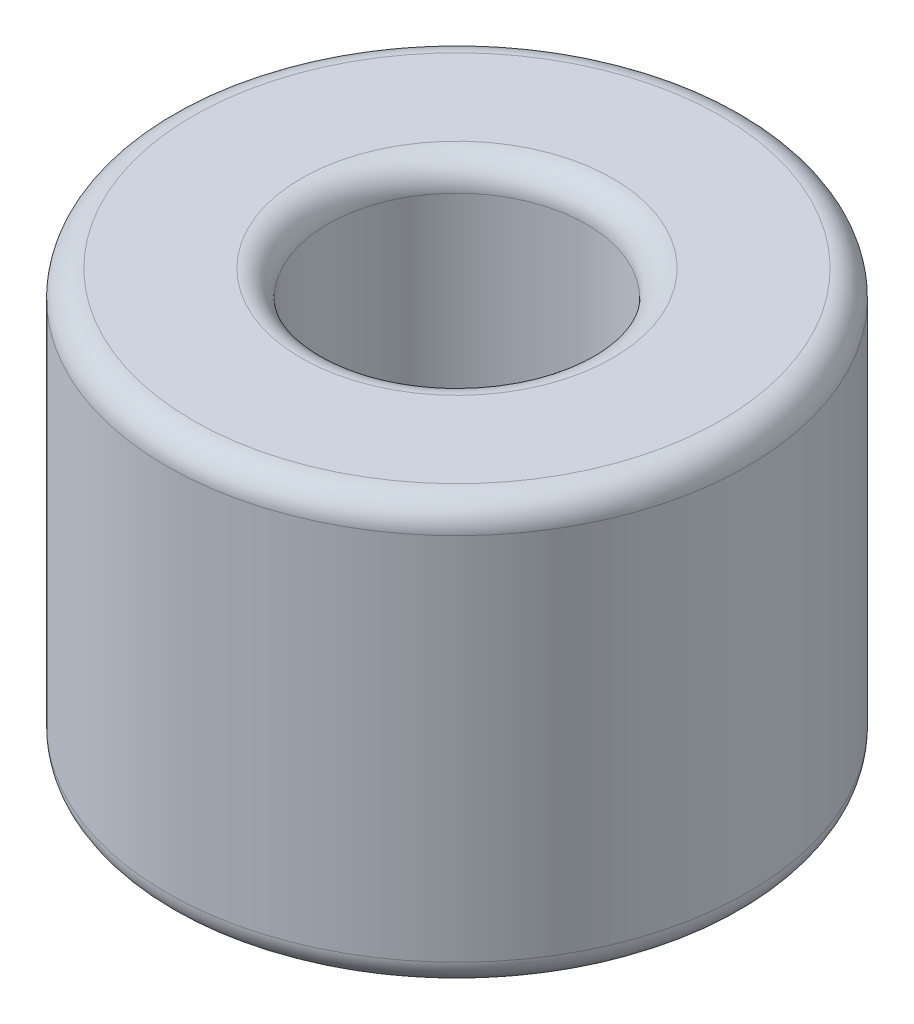
ISO-10303-21;
HEADER;
FILE_DESCRIPTION(('STEP AP214'),'2;1');
FILE_NAME('part.step','',(''),(''),'','','');
FILE_SCHEMA(('AUTOMOTIVE_DESIGN { 1 0 10303 214 1 1 1 1 }'));
ENDSEC;
DATA;
#1=APPLICATION_CONTEXT('core data for automotive mechanical design processes');
#2=APPLICATION_PROTOCOL_DEFINITION('international standard','automotive_design',2000,#1);
#3=PRODUCT_CONTEXT('',#1,'mechanical');
#4=PRODUCT('Part','Part','',(#3));
#5=PRODUCT_RELATED_PRODUCT_CATEGORY('part','',(#4));
#6=PRODUCT_DEFINITION_FORMATION('','',#4);
#7=PRODUCT_DEFINITION_CONTEXT('part definition',#1,'design');
#8=PRODUCT_DEFINITION('design','',#6,#7);
#9=PRODUCT_DEFINITION_SHAPE('','',#8);
#10=(LENGTH_UNIT() NAMED_UNIT(*) SI_UNIT(.MILLI.,.METRE.));
#11=(NAMED_UNIT(*) PLANE_ANGLE_UNIT() SI_UNIT($,.RADIAN.));
#12=(NAMED_UNIT(*) SI_UNIT($,.STERADIAN.) SOLID_ANGLE_UNIT());
#13=UNCERTAINTY_MEASURE_WITH_UNIT(LENGTH_MEASURE(1.E-05),#10,'distance_accuracy_value','');
#14=(GEOMETRIC_REPRESENTATION_CONTEXT(3) GLOBAL_UNCERTAINTY_ASSIGNED_CONTEXT((#13)) GLOBAL_UNIT_ASSIGNED_CONTEXT((#10,
#11,#12)) REPRESENTATION_CONTEXT('',''));
#15=CARTESIAN_POINT('',(0.,0.,0.));
#16=DIRECTION('',(0.,0.,1.));
#17=DIRECTION('',(1.,0.,0.));
#18=AXIS2_PLACEMENT_3D('',#15,#16,#17);
#19=CARTESIAN_POINT('',(0.,8.,0.));
#20=DIRECTION('',(0.,1.,0.));
#21=DIRECTION('',(0.,0.,1.));
#22=AXIS2_PLACEMENT_3D('',#19,#20,#21);
#23=PLANE('',#22);
#24=CARTESIAN_POINT('',(0.,8.,0.));
#25=DIRECTION('',(0.,1.,0.));
#26=DIRECTION('',(0.,0.,1.));
#27=AXIS2_PLACEMENT_3D('',#24,#25,#26);
#28=CIRCLE('',#27,2.95);
#29=CARTESIAN_POINT('',(0.,8.,2.95));
#30=VERTEX_POINT('',#29);
#31=EDGE_CURVE('E10',#30,#30,#28,.F.);
#32=ORIENTED_EDGE('',*,*,#31,.T.);
#33=EDGE_LOOP('',(#32));
#34=FACE_BOUND('',#33,.T.);
#35=CARTESIAN_POINT('',(0.,8.,0.));
#36=DIRECTION('',(0.,1.,0.));
#37=DIRECTION('',(0.,0.,1.));
#38=AXIS2_PLACEMENT_3D('',#35,#36,#37);
#39=CIRCLE('',#38,5.);
#40=CARTESIAN_POINT('',(0.,8.,5.));
#41=VERTEX_POINT('',#40);
#42=EDGE_CURVE('E47',#41,#41,#39,.T.);
#43=ORIENTED_EDGE('',*,*,#42,.T.);
#44=EDGE_LOOP('',(#43));
#45=FACE_BOUND('',#44,.T.);
#46=ADVANCED_FACE('F39',(#34,#45),#23,.T.);
#47=CARTESIAN_POINT('',(0.,0.,0.));
#48=DIRECTION('',(0.,1.,0.));
#49=DIRECTION('',(0.,0.,1.));
#50=AXIS2_PLACEMENT_3D('',#47,#48,#49);
#51=PLANE('',#50);
#52=CARTESIAN_POINT('',(0.,0.,0.));
#53=DIRECTION('',(0.,1.,0.));
#54=DIRECTION('',(0.,0.,1.));
#55=AXIS2_PLACEMENT_3D('',#52,#53,#54);
#56=CIRCLE('',#55,5.);
#57=CARTESIAN_POINT('',(0.,0.,5.));
#58=VERTEX_POINT('',#57);
#59=EDGE_CURVE('E63',#58,#58,#56,.F.);
#60=ORIENTED_EDGE('',*,*,#59,.T.);
#61=EDGE_LOOP('',(#60));
#62=FACE_BOUND('',#61,.T.);
#63=CARTESIAN_POINT('',(0.,0.,0.));
#64=DIRECTION('',(0.,1.,0.));
#65=DIRECTION('',(0.,0.,1.));
#66=AXIS2_PLACEMENT_3D('',#63,#64,#65);
#67=CIRCLE('',#66,2.95);
#68=CARTESIAN_POINT('',(0.,0.,2.95));
#69=VERTEX_POINT('',#68);
#70=EDGE_CURVE('E67',#69,#69,#67,.T.);
#71=ORIENTED_EDGE('',*,*,#70,.T.);
#72=EDGE_LOOP('',(#71));
#73=FACE_BOUND('',#72,.T.);
#74=ADVANCED_FACE('F91',(#62,#73),#51,.F.);
#75=CARTESIAN_POINT('',(0.,8.,0.));
#76=DIRECTION('',(0.,-1.,0.));
#77=DIRECTION('',(0.,0.,-1.));
#78=AXIS2_PLACEMENT_3D('',#75,#76,#77);
#79=CYLINDRICAL_SURFACE('',#78,5.5);
#80=CARTESIAN_POINT('',(0.,0.5,0.));
#81=DIRECTION('',(0.,1.,0.));
#82=DIRECTION('',(0.,0.,1.));
#83=AXIS2_PLACEMENT_3D('',#80,#81,#82);
#84=CIRCLE('',#83,5.5);
#85=CARTESIAN_POINT('',(0.,0.5,5.5));
#86=VERTEX_POINT('',#85);
#87=EDGE_CURVE('E71',#86,#86,#84,.T.);
#88=ORIENTED_EDGE('',*,*,#87,.T.);
#89=EDGE_LOOP('',(#88));
#90=FACE_BOUND('',#89,.T.);
#91=CARTESIAN_POINT('',(0.,7.5,0.));
#92=DIRECTION('',(0.,1.,0.));
#93=DIRECTION('',(0.,0.,1.));
#94=AXIS2_PLACEMENT_3D('',#91,#92,#93);
#95=CIRCLE('',#94,5.5);
#96=CARTESIAN_POINT('',(0.,7.5,5.5));
#97=VERTEX_POINT('',#96);
#98=EDGE_CURVE('E75',#97,#97,#95,.F.);
#99=ORIENTED_EDGE('',*,*,#98,.T.);
#100=EDGE_LOOP('',(#99));
#101=FACE_BOUND('',#100,.T.);
#102=ADVANCED_FACE('F80',(#90,#101),#79,.T.);
#103=CARTESIAN_POINT('',(0.,8.,0.));
#104=DIRECTION('',(0.,-1.,0.));
#105=DIRECTION('',(0.,0.,-1.));
#106=AXIS2_PLACEMENT_3D('',#103,#104,#105);
#107=CYLINDRICAL_SURFACE('',#106,2.45);
#108=CARTESIAN_POINT('',(0.,0.5,0.));
#109=DIRECTION('',(0.,1.,0.));
#110=DIRECTION('',(0.,0.,1.));
#111=AXIS2_PLACEMENT_3D('',#108,#109,#110);
#112=CIRCLE('',#111,2.45);
#113=CARTESIAN_POINT('',(0.,0.5,2.45));
#114=VERTEX_POINT('',#113);
#115=EDGE_CURVE('E52',#114,#114,#112,.F.);
#116=ORIENTED_EDGE('',*,*,#115,.T.);
#117=EDGE_LOOP('',(#116));
#118=FACE_BOUND('',#117,.T.);
#119=CARTESIAN_POINT('',(0.,7.5,0.));
#120=DIRECTION('',(0.,1.,0.));
#121=DIRECTION('',(0.,0.,1.));
#122=AXIS2_PLACEMENT_3D('',#119,#120,#121);
#123=CIRCLE('',#122,2.45);
#124=CARTESIAN_POINT('',(0.,7.5,2.45));
#125=VERTEX_POINT('',#124);
#126=EDGE_CURVE('E57',#125,#125,#123,.T.);
#127=ORIENTED_EDGE('',*,*,#126,.T.);
#128=EDGE_LOOP('',(#127));
#129=FACE_BOUND('',#128,.T.);
#130=ADVANCED_FACE('F99',(#118,#129),#107,.F.);
#131=CARTESIAN_POINT('',(0.,0.5,0.));
#132=DIRECTION('',(0.,1.,0.));
#133=DIRECTION('',(0.,0.,1.));
#134=AXIS2_PLACEMENT_3D('',#131,#132,#133);
#135=TOROIDAL_SURFACE('',#134,5.,0.5);
#136=ORIENTED_EDGE('',*,*,#59,.F.);
#137=EDGE_LOOP('',(#136));
#138=FACE_BOUND('',#137,.T.);
#139=ORIENTED_EDGE('',*,*,#87,.F.);
#140=EDGE_LOOP('',(#139));
#141=FACE_BOUND('',#140,.T.);
#142=ADVANCED_FACE('F104',(#138,#141),#135,.T.);
#143=CARTESIAN_POINT('',(0.,0.5,0.));
#144=DIRECTION('',(0.,1.,0.));
#145=DIRECTION('',(0.,0.,1.));
#146=AXIS2_PLACEMENT_3D('',#143,#144,#145);
#147=TOROIDAL_SURFACE('',#146,2.95,0.5);
#148=ORIENTED_EDGE('',*,*,#115,.F.);
#149=EDGE_LOOP('',(#148));
#150=FACE_BOUND('',#149,.T.);
#151=ORIENTED_EDGE('',*,*,#70,.F.);
#152=EDGE_LOOP('',(#151));
#153=FACE_BOUND('',#152,.T.);
#154=ADVANCED_FACE('F88',(#150,#153),#147,.T.);
#155=CARTESIAN_POINT('',(0.,7.5,0.));
#156=DIRECTION('',(0.,1.,0.));
#157=DIRECTION('',(0.,0.,1.));
#158=AXIS2_PLACEMENT_3D('',#155,#156,#157);
#159=TOROIDAL_SURFACE('',#158,2.95,0.5);
#160=ORIENTED_EDGE('',*,*,#31,.F.);
#161=EDGE_LOOP('',(#160));
#162=FACE_BOUND('',#161,.T.);
#163=ORIENTED_EDGE('',*,*,#126,.F.);
#164=EDGE_LOOP('',(#163));
#165=FACE_BOUND('',#164,.T.);
#166=ADVANCED_FACE('F84',(#162,#165),#159,.T.);
#167=CARTESIAN_POINT('',(0.,7.5,0.));
#168=DIRECTION('',(0.,1.,0.));
#169=DIRECTION('',(0.,0.,1.));
#170=AXIS2_PLACEMENT_3D('',#167,#168,#169);
#171=TOROIDAL_SURFACE('',#170,5.,0.5);
#172=ORIENTED_EDGE('',*,*,#98,.F.);
#173=EDGE_LOOP('',(#172));
#174=FACE_BOUND('',#173,.T.);
#175=ORIENTED_EDGE('',*,*,#42,.F.);
#176=EDGE_LOOP('',(#175));
#177=FACE_BOUND('',#176,.T.);
#178=ADVANCED_FACE('F41',(#174,#177),#171,.T.);
#179=CLOSED_SHELL('',(#46,#74,#102,#130,#142,#154,#166,#178));
#180=MANIFOLD_SOLID_BREP('B2',#179);
#181=ADVANCED_BREP_SHAPE_REPRESENTATION('',(#18,#180),#14);
#182=SHAPE_DEFINITION_REPRESENTATION(#9,#181);
ENDSEC;
END-ISO-10303-21;
